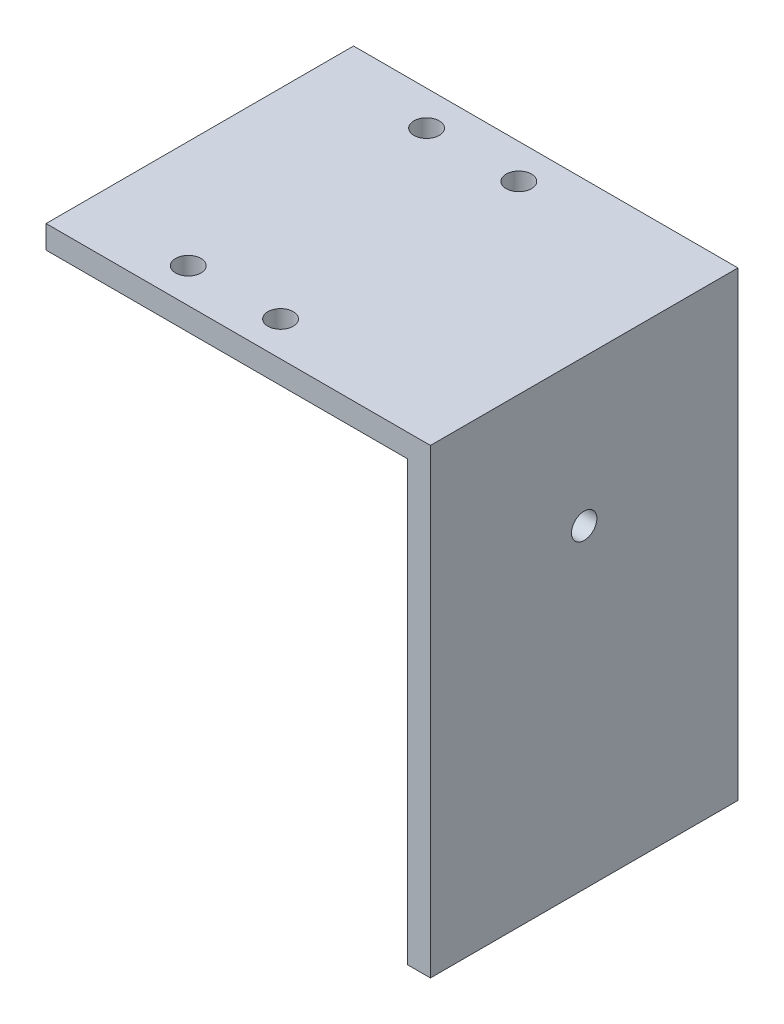
ISO-10303-21;
HEADER;
FILE_DESCRIPTION(('STEP AP214'),'2;1');
FILE_NAME('part.step','',(''),(''),'','','');
FILE_SCHEMA(('AUTOMOTIVE_DESIGN { 1 0 10303 214 1 1 1 1 }'));
ENDSEC;
DATA;
#1=APPLICATION_CONTEXT('core data for automotive mechanical design processes');
#2=APPLICATION_PROTOCOL_DEFINITION('international standard','automotive_design',2000,#1);
#3=PRODUCT_CONTEXT('',#1,'mechanical');
#4=PRODUCT('Part','Part','',(#3));
#5=PRODUCT_RELATED_PRODUCT_CATEGORY('part','',(#4));
#6=PRODUCT_DEFINITION_FORMATION('','',#4);
#7=PRODUCT_DEFINITION_CONTEXT('part definition',#1,'design');
#8=PRODUCT_DEFINITION('design','',#6,#7);
#9=PRODUCT_DEFINITION_SHAPE('','',#8);
#10=(LENGTH_UNIT() NAMED_UNIT(*) SI_UNIT(.MILLI.,.METRE.));
#11=(NAMED_UNIT(*) PLANE_ANGLE_UNIT() SI_UNIT($,.RADIAN.));
#12=(NAMED_UNIT(*) SI_UNIT($,.STERADIAN.) SOLID_ANGLE_UNIT());
#13=UNCERTAINTY_MEASURE_WITH_UNIT(LENGTH_MEASURE(1.E-05),#10,'distance_accuracy_value','');
#14=(GEOMETRIC_REPRESENTATION_CONTEXT(3) GLOBAL_UNCERTAINTY_ASSIGNED_CONTEXT((#13)) GLOBAL_UNIT_ASSIGNED_CONTEXT((#10,
#11,#12)) REPRESENTATION_CONTEXT('',''));
#15=CARTESIAN_POINT('',(0.,0.,0.));
#16=DIRECTION('',(0.,0.,1.));
#17=DIRECTION('',(1.,0.,0.));
#18=AXIS2_PLACEMENT_3D('',#15,#16,#17);
#19=CARTESIAN_POINT('',(0.,0.,40.));
#20=DIRECTION('',(1.,0.,0.));
#21=DIRECTION('',(0.,0.,-1.));
#22=AXIS2_PLACEMENT_3D('',#19,#20,#21);
#23=PLANE('',#22);
#24=DIRECTION('',(0.,-1.,0.));
#25=VECTOR('',#24,1.);
#26=CARTESIAN_POINT('',(0.,0.,0.));
#27=LINE('',#26,#25);
#28=CARTESIAN_POINT('',(0.,0.,0.));
#29=VERTEX_POINT('',#28);
#30=CARTESIAN_POINT('',(0.,-3.,0.));
#31=VERTEX_POINT('',#30);
#32=EDGE_CURVE('E122',#29,#31,#27,.T.);
#33=ORIENTED_EDGE('',*,*,#32,.T.);
#34=DIRECTION('',(0.,0.,-1.));
#35=VECTOR('',#34,1.);
#36=CARTESIAN_POINT('',(0.,-3.,40.));
#37=LINE('',#36,#35);
#38=CARTESIAN_POINT('',(0.,-3.,40.));
#39=VERTEX_POINT('',#38);
#40=EDGE_CURVE('E11',#39,#31,#37,.T.);
#41=ORIENTED_EDGE('',*,*,#40,.F.);
#42=DIRECTION('',(0.,-1.,0.));
#43=VECTOR('',#42,1.);
#44=CARTESIAN_POINT('',(0.,0.,40.));
#45=LINE('',#44,#43);
#46=CARTESIAN_POINT('',(0.,0.,40.));
#47=VERTEX_POINT('',#46);
#48=EDGE_CURVE('E133',#47,#39,#45,.T.);
#49=ORIENTED_EDGE('',*,*,#48,.F.);
#50=DIRECTION('',(0.,0.,-1.));
#51=VECTOR('',#50,1.);
#52=CARTESIAN_POINT('',(0.,0.,40.));
#53=LINE('',#52,#51);
#54=EDGE_CURVE('E118',#47,#29,#53,.T.);
#55=ORIENTED_EDGE('',*,*,#54,.T.);
#56=EDGE_LOOP('',(#33,#41,#49,#55));
#57=FACE_BOUND('',#56,.T.);
#58=ADVANCED_FACE('F38',(#57),#23,.F.);
#59=CARTESIAN_POINT('',(0.,-3.,40.));
#60=DIRECTION('',(0.,1.,0.));
#61=DIRECTION('',(0.,0.,1.));
#62=AXIS2_PLACEMENT_3D('',#59,#60,#61);
#63=PLANE('',#62);
#64=CARTESIAN_POINT('',(14.,-3.,35.5));
#65=DIRECTION('',(0.,1.,0.));
#66=DIRECTION('',(0.,0.,1.));
#67=AXIS2_PLACEMENT_3D('',#64,#65,#66);
#68=CIRCLE('',#67,1.65);
#69=CARTESIAN_POINT('',(14.,-3.,37.15));
#70=VERTEX_POINT('',#69);
#71=EDGE_CURVE('E126',#70,#70,#68,.T.);
#72=ORIENTED_EDGE('',*,*,#71,.T.);
#73=EDGE_LOOP('',(#72));
#74=FACE_BOUND('',#73,.T.);
#75=CARTESIAN_POINT('',(26.,-3.,4.5));
#76=DIRECTION('',(0.,1.,0.));
#77=DIRECTION('',(0.,0.,1.));
#78=AXIS2_PLACEMENT_3D('',#75,#76,#77);
#79=CIRCLE('',#78,1.65);
#80=CARTESIAN_POINT('',(26.,-3.,6.15));
#81=VERTEX_POINT('',#80);
#82=EDGE_CURVE('E279',#81,#81,#79,.T.);
#83=ORIENTED_EDGE('',*,*,#82,.T.);
#84=EDGE_LOOP('',(#83));
#85=FACE_BOUND('',#84,.T.);
#86=CARTESIAN_POINT('',(26.,-3.,35.5));
#87=DIRECTION('',(0.,1.,0.));
#88=DIRECTION('',(0.,0.,1.));
#89=AXIS2_PLACEMENT_3D('',#86,#87,#88);
#90=CIRCLE('',#89,1.65);
#91=CARTESIAN_POINT('',(26.,-3.,37.15));
#92=VERTEX_POINT('',#91);
#93=EDGE_CURVE('E276',#92,#92,#90,.T.);
#94=ORIENTED_EDGE('',*,*,#93,.T.);
#95=EDGE_LOOP('',(#94));
#96=FACE_BOUND('',#95,.T.);
#97=CARTESIAN_POINT('',(14.,-3.,4.5));
#98=DIRECTION('',(0.,1.,0.));
#99=DIRECTION('',(0.,0.,1.));
#100=AXIS2_PLACEMENT_3D('',#97,#98,#99);
#101=CIRCLE('',#100,1.65);
#102=CARTESIAN_POINT('',(14.,-3.,6.15));
#103=VERTEX_POINT('',#102);
#104=EDGE_CURVE('E274',#103,#103,#101,.T.);
#105=ORIENTED_EDGE('',*,*,#104,.T.);
#106=EDGE_LOOP('',(#105));
#107=FACE_BOUND('',#106,.T.);
#108=DIRECTION('',(1.,0.,0.));
#109=VECTOR('',#108,1.);
#110=CARTESIAN_POINT('',(0.,-3.,0.));
#111=LINE('',#110,#109);
#112=CARTESIAN_POINT('',(47.,-3.,0.));
#113=VERTEX_POINT('',#112);
#114=EDGE_CURVE('E125',#31,#113,#111,.T.);
#115=ORIENTED_EDGE('',*,*,#114,.T.);
#116=DIRECTION('',(0.,0.,-1.));
#117=VECTOR('',#116,1.);
#118=CARTESIAN_POINT('',(47.,-3.,40.));
#119=LINE('',#118,#117);
#120=CARTESIAN_POINT('',(47.,-3.,40.));
#121=VERTEX_POINT('',#120);
#122=EDGE_CURVE('E46',#121,#113,#119,.T.);
#123=ORIENTED_EDGE('',*,*,#122,.F.);
#124=DIRECTION('',(1.,0.,0.));
#125=VECTOR('',#124,1.);
#126=CARTESIAN_POINT('',(0.,-3.,40.));
#127=LINE('',#126,#125);
#128=EDGE_CURVE('E91',#39,#121,#127,.T.);
#129=ORIENTED_EDGE('',*,*,#128,.F.);
#130=ORIENTED_EDGE('',*,*,#40,.T.);
#131=EDGE_LOOP('',(#115,#123,#129,#130));
#132=FACE_BOUND('',#131,.T.);
#133=ADVANCED_FACE('F161',(#74,#85,#96,#107,#132),#63,.F.);
#134=CARTESIAN_POINT('',(47.,-3.,40.));
#135=DIRECTION('',(1.,0.,0.));
#136=DIRECTION('',(0.,1.,0.));
#137=AXIS2_PLACEMENT_3D('',#134,#135,#136);
#138=PLANE('',#137);
#139=CARTESIAN_POINT('',(47.,-19.05,20.));
#140=DIRECTION('',(1.,0.,0.));
#141=DIRECTION('',(0.,1.,0.));
#142=AXIS2_PLACEMENT_3D('',#139,#140,#141);
#143=CIRCLE('',#142,1.65);
#144=CARTESIAN_POINT('',(47.,-17.4,20.));
#145=VERTEX_POINT('',#144);
#146=EDGE_CURVE('E304',#145,#145,#143,.T.);
#147=ORIENTED_EDGE('',*,*,#146,.T.);
#148=EDGE_LOOP('',(#147));
#149=FACE_BOUND('',#148,.T.);
#150=DIRECTION('',(0.,-1.,0.));
#151=VECTOR('',#150,1.);
#152=CARTESIAN_POINT('',(47.,-3.,0.));
#153=LINE('',#152,#151);
#154=CARTESIAN_POINT('',(47.,-60.,0.));
#155=VERTEX_POINT('',#154);
#156=EDGE_CURVE('E128',#113,#155,#153,.T.);
#157=ORIENTED_EDGE('',*,*,#156,.T.);
#158=DIRECTION('',(0.,0.,-1.));
#159=VECTOR('',#158,1.);
#160=CARTESIAN_POINT('',(47.,-60.,40.));
#161=LINE('',#160,#159);
#162=CARTESIAN_POINT('',(47.,-60.,40.));
#163=VERTEX_POINT('',#162);
#164=EDGE_CURVE('E113',#163,#155,#161,.T.);
#165=ORIENTED_EDGE('',*,*,#164,.F.);
#166=DIRECTION('',(0.,-1.,0.));
#167=VECTOR('',#166,1.);
#168=CARTESIAN_POINT('',(47.,-3.,40.));
#169=LINE('',#168,#167);
#170=EDGE_CURVE('E104',#121,#163,#169,.T.);
#171=ORIENTED_EDGE('',*,*,#170,.F.);
#172=ORIENTED_EDGE('',*,*,#122,.T.);
#173=EDGE_LOOP('',(#157,#165,#171,#172));
#174=FACE_BOUND('',#173,.T.);
#175=ADVANCED_FACE('F139',(#149,#174),#138,.F.);
#176=CARTESIAN_POINT('',(47.,-60.,40.));
#177=DIRECTION('',(0.,1.,0.));
#178=DIRECTION('',(0.,0.,1.));
#179=AXIS2_PLACEMENT_3D('',#176,#177,#178);
#180=PLANE('',#179);
#181=DIRECTION('',(1.,0.,0.));
#182=VECTOR('',#181,1.);
#183=CARTESIAN_POINT('',(47.,-60.,0.));
#184=LINE('',#183,#182);
#185=CARTESIAN_POINT('',(50.,-60.,0.));
#186=VERTEX_POINT('',#185);
#187=EDGE_CURVE('E112',#155,#186,#184,.T.);
#188=ORIENTED_EDGE('',*,*,#187,.T.);
#189=DIRECTION('',(0.,0.,-1.));
#190=VECTOR('',#189,1.);
#191=CARTESIAN_POINT('',(50.,-60.,40.));
#192=LINE('',#191,#190);
#193=CARTESIAN_POINT('',(50.,-60.,40.));
#194=VERTEX_POINT('',#193);
#195=EDGE_CURVE('E109',#194,#186,#192,.T.);
#196=ORIENTED_EDGE('',*,*,#195,.F.);
#197=DIRECTION('',(1.,0.,0.));
#198=VECTOR('',#197,1.);
#199=CARTESIAN_POINT('',(47.,-60.,40.));
#200=LINE('',#199,#198);
#201=EDGE_CURVE('E98',#163,#194,#200,.T.);
#202=ORIENTED_EDGE('',*,*,#201,.F.);
#203=ORIENTED_EDGE('',*,*,#164,.T.);
#204=EDGE_LOOP('',(#188,#196,#202,#203));
#205=FACE_BOUND('',#204,.T.);
#206=ADVANCED_FACE('F110',(#205),#180,.F.);
#207=CARTESIAN_POINT('',(50.,0.,40.));
#208=DIRECTION('',(-1.,0.,0.));
#209=DIRECTION('',(0.,0.,1.));
#210=AXIS2_PLACEMENT_3D('',#207,#208,#209);
#211=PLANE('',#210);
#212=CARTESIAN_POINT('',(50.,-19.05,20.));
#213=DIRECTION('',(1.,0.,0.));
#214=DIRECTION('',(0.,0.,-1.));
#215=AXIS2_PLACEMENT_3D('',#212,#213,#214);
#216=CIRCLE('',#215,1.65);
#217=CARTESIAN_POINT('',(50.,-19.05,18.35));
#218=VERTEX_POINT('',#217);
#219=EDGE_CURVE('E307',#218,#218,#216,.T.);
#220=ORIENTED_EDGE('',*,*,#219,.F.);
#221=EDGE_LOOP('',(#220));
#222=FACE_BOUND('',#221,.T.);
#223=DIRECTION('',(0.,1.,0.));
#224=VECTOR('',#223,1.);
#225=CARTESIAN_POINT('',(50.,0.,0.));
#226=LINE('',#225,#224);
#227=CARTESIAN_POINT('',(50.,0.,0.));
#228=VERTEX_POINT('',#227);
#229=EDGE_CURVE('E77',#186,#228,#226,.T.);
#230=ORIENTED_EDGE('',*,*,#229,.T.);
#231=DIRECTION('',(0.,0.,-1.));
#232=VECTOR('',#231,1.);
#233=CARTESIAN_POINT('',(50.,0.,40.));
#234=LINE('',#233,#232);
#235=CARTESIAN_POINT('',(50.,0.,40.));
#236=VERTEX_POINT('',#235);
#237=EDGE_CURVE('E114',#236,#228,#234,.T.);
#238=ORIENTED_EDGE('',*,*,#237,.F.);
#239=DIRECTION('',(0.,1.,0.));
#240=VECTOR('',#239,1.);
#241=CARTESIAN_POINT('',(50.,0.,40.));
#242=LINE('',#241,#240);
#243=EDGE_CURVE('E102',#194,#236,#242,.T.);
#244=ORIENTED_EDGE('',*,*,#243,.F.);
#245=ORIENTED_EDGE('',*,*,#195,.T.);
#246=EDGE_LOOP('',(#230,#238,#244,#245));
#247=FACE_BOUND('',#246,.T.);
#248=ADVANCED_FACE('F116',(#222,#247),#211,.F.);
#249=CARTESIAN_POINT('',(0.,0.,40.));
#250=DIRECTION('',(0.,-1.,0.));
#251=DIRECTION('',(0.,0.,-1.));
#252=AXIS2_PLACEMENT_3D('',#249,#250,#251);
#253=PLANE('',#252);
#254=CARTESIAN_POINT('',(14.,0.,35.5));
#255=DIRECTION('',(0.,1.,0.));
#256=DIRECTION('',(0.,0.,1.));
#257=AXIS2_PLACEMENT_3D('',#254,#255,#256);
#258=CIRCLE('',#257,1.65);
#259=CARTESIAN_POINT('',(14.,0.,37.15));
#260=VERTEX_POINT('',#259);
#261=EDGE_CURVE('E281',#260,#260,#258,.T.);
#262=ORIENTED_EDGE('',*,*,#261,.F.);
#263=EDGE_LOOP('',(#262));
#264=FACE_BOUND('',#263,.T.);
#265=CARTESIAN_POINT('',(26.,0.,4.5));
#266=DIRECTION('',(0.,1.,0.));
#267=DIRECTION('',(0.,0.,1.));
#268=AXIS2_PLACEMENT_3D('',#265,#266,#267);
#269=CIRCLE('',#268,1.65);
#270=CARTESIAN_POINT('',(26.,0.,6.15));
#271=VERTEX_POINT('',#270);
#272=EDGE_CURVE('E296',#271,#271,#269,.T.);
#273=ORIENTED_EDGE('',*,*,#272,.F.);
#274=EDGE_LOOP('',(#273));
#275=FACE_BOUND('',#274,.T.);
#276=CARTESIAN_POINT('',(26.,0.,35.5));
#277=DIRECTION('',(0.,1.,0.));
#278=DIRECTION('',(0.,0.,1.));
#279=AXIS2_PLACEMENT_3D('',#276,#277,#278);
#280=CIRCLE('',#279,1.65);
#281=CARTESIAN_POINT('',(26.,0.,37.15));
#282=VERTEX_POINT('',#281);
#283=EDGE_CURVE('E299',#282,#282,#280,.T.);
#284=ORIENTED_EDGE('',*,*,#283,.F.);
#285=EDGE_LOOP('',(#284));
#286=FACE_BOUND('',#285,.T.);
#287=CARTESIAN_POINT('',(14.,0.,4.5));
#288=DIRECTION('',(0.,1.,0.));
#289=DIRECTION('',(0.,0.,1.));
#290=AXIS2_PLACEMENT_3D('',#287,#288,#289);
#291=CIRCLE('',#290,1.65);
#292=CARTESIAN_POINT('',(14.,0.,6.15));
#293=VERTEX_POINT('',#292);
#294=EDGE_CURVE('E271',#293,#293,#291,.T.);
#295=ORIENTED_EDGE('',*,*,#294,.F.);
#296=EDGE_LOOP('',(#295));
#297=FACE_BOUND('',#296,.T.);
#298=DIRECTION('',(-1.,0.,0.));
#299=VECTOR('',#298,1.);
#300=CARTESIAN_POINT('',(0.,0.,0.));
#301=LINE('',#300,#299);
#302=EDGE_CURVE('E83',#228,#29,#301,.T.);
#303=ORIENTED_EDGE('',*,*,#302,.T.);
#304=ORIENTED_EDGE('',*,*,#54,.F.);
#305=DIRECTION('',(-1.,0.,0.));
#306=VECTOR('',#305,1.);
#307=CARTESIAN_POINT('',(0.,0.,40.));
#308=LINE('',#307,#306);
#309=EDGE_CURVE('E54',#236,#47,#308,.T.);
#310=ORIENTED_EDGE('',*,*,#309,.F.);
#311=ORIENTED_EDGE('',*,*,#237,.T.);
#312=EDGE_LOOP('',(#303,#304,#310,#311));
#313=FACE_BOUND('',#312,.T.);
#314=ADVANCED_FACE('F146',(#264,#275,#286,#297,#313),#253,.F.);
#315=CARTESIAN_POINT('',(0.,0.,40.));
#316=DIRECTION('',(0.,0.,1.));
#317=DIRECTION('',(1.,0.,0.));
#318=AXIS2_PLACEMENT_3D('',#315,#316,#317);
#319=PLANE('',#318);
#320=ORIENTED_EDGE('',*,*,#48,.T.);
#321=ORIENTED_EDGE('',*,*,#128,.T.);
#322=ORIENTED_EDGE('',*,*,#170,.T.);
#323=ORIENTED_EDGE('',*,*,#201,.T.);
#324=ORIENTED_EDGE('',*,*,#243,.T.);
#325=ORIENTED_EDGE('',*,*,#309,.T.);
#326=EDGE_LOOP('',(#320,#321,#322,#323,#324,#325));
#327=FACE_BOUND('',#326,.T.);
#328=ADVANCED_FACE('F100',(#327),#319,.T.);
#329=CARTESIAN_POINT('',(0.,0.,0.));
#330=DIRECTION('',(0.,0.,1.));
#331=DIRECTION('',(1.,0.,0.));
#332=AXIS2_PLACEMENT_3D('',#329,#330,#331);
#333=PLANE('',#332);
#334=ORIENTED_EDGE('',*,*,#32,.F.);
#335=ORIENTED_EDGE('',*,*,#302,.F.);
#336=ORIENTED_EDGE('',*,*,#229,.F.);
#337=ORIENTED_EDGE('',*,*,#187,.F.);
#338=ORIENTED_EDGE('',*,*,#156,.F.);
#339=ORIENTED_EDGE('',*,*,#114,.F.);
#340=EDGE_LOOP('',(#334,#335,#336,#337,#338,#339));
#341=FACE_BOUND('',#340,.T.);
#342=ADVANCED_FACE('F142',(#341),#333,.F.);
#343=CARTESIAN_POINT('',(14.,-10.,4.5));
#344=DIRECTION('',(0.,1.,0.));
#345=DIRECTION('',(0.,0.,1.));
#346=AXIS2_PLACEMENT_3D('',#343,#344,#345);
#347=CYLINDRICAL_SURFACE('',#346,1.65);
#348=ORIENTED_EDGE('',*,*,#294,.T.);
#349=EDGE_LOOP('',(#348));
#350=FACE_BOUND('',#349,.T.);
#351=ORIENTED_EDGE('',*,*,#104,.F.);
#352=EDGE_LOOP('',(#351));
#353=FACE_BOUND('',#352,.T.);
#354=ADVANCED_FACE('F222',(#350,#353),#347,.F.);
#355=CARTESIAN_POINT('',(26.,-10.,35.5));
#356=DIRECTION('',(0.,1.,0.));
#357=DIRECTION('',(0.,0.,1.));
#358=AXIS2_PLACEMENT_3D('',#355,#356,#357);
#359=CYLINDRICAL_SURFACE('',#358,1.65);
#360=ORIENTED_EDGE('',*,*,#283,.T.);
#361=EDGE_LOOP('',(#360));
#362=FACE_BOUND('',#361,.T.);
#363=ORIENTED_EDGE('',*,*,#93,.F.);
#364=EDGE_LOOP('',(#363));
#365=FACE_BOUND('',#364,.T.);
#366=ADVANCED_FACE('F214',(#362,#365),#359,.F.);
#367=CARTESIAN_POINT('',(26.,-10.,4.5));
#368=DIRECTION('',(0.,1.,0.));
#369=DIRECTION('',(0.,0.,1.));
#370=AXIS2_PLACEMENT_3D('',#367,#368,#369);
#371=CYLINDRICAL_SURFACE('',#370,1.65);
#372=ORIENTED_EDGE('',*,*,#272,.T.);
#373=EDGE_LOOP('',(#372));
#374=FACE_BOUND('',#373,.T.);
#375=ORIENTED_EDGE('',*,*,#82,.F.);
#376=EDGE_LOOP('',(#375));
#377=FACE_BOUND('',#376,.T.);
#378=ADVANCED_FACE('F207',(#374,#377),#371,.F.);
#379=CARTESIAN_POINT('',(14.,-10.,35.5));
#380=DIRECTION('',(0.,1.,0.));
#381=DIRECTION('',(0.,0.,1.));
#382=AXIS2_PLACEMENT_3D('',#379,#380,#381);
#383=CYLINDRICAL_SURFACE('',#382,1.65);
#384=ORIENTED_EDGE('',*,*,#261,.T.);
#385=EDGE_LOOP('',(#384));
#386=FACE_BOUND('',#385,.T.);
#387=ORIENTED_EDGE('',*,*,#71,.F.);
#388=EDGE_LOOP('',(#387));
#389=FACE_BOUND('',#388,.T.);
#390=ADVANCED_FACE('F197',(#386,#389),#383,.F.);
#391=CARTESIAN_POINT('',(40.,-19.05,20.));
#392=DIRECTION('',(1.,0.,0.));
#393=DIRECTION('',(0.,0.,-1.));
#394=AXIS2_PLACEMENT_3D('',#391,#392,#393);
#395=CYLINDRICAL_SURFACE('',#394,1.65);
#396=ORIENTED_EDGE('',*,*,#219,.T.);
#397=EDGE_LOOP('',(#396));
#398=FACE_BOUND('',#397,.T.);
#399=ORIENTED_EDGE('',*,*,#146,.F.);
#400=EDGE_LOOP('',(#399));
#401=FACE_BOUND('',#400,.T.);
#402=ADVANCED_FACE('F193',(#398,#401),#395,.F.);
#403=CLOSED_SHELL('',(#58,#133,#175,#206,#248,#314,#328,#342,#354,#366,#378,#390,#402));
#404=MANIFOLD_SOLID_BREP('B2',#403);
#405=ADVANCED_BREP_SHAPE_REPRESENTATION('',(#18,#404),#14);
#406=SHAPE_DEFINITION_REPRESENTATION(#9,#405);
ENDSEC;
END-ISO-10303-21;
